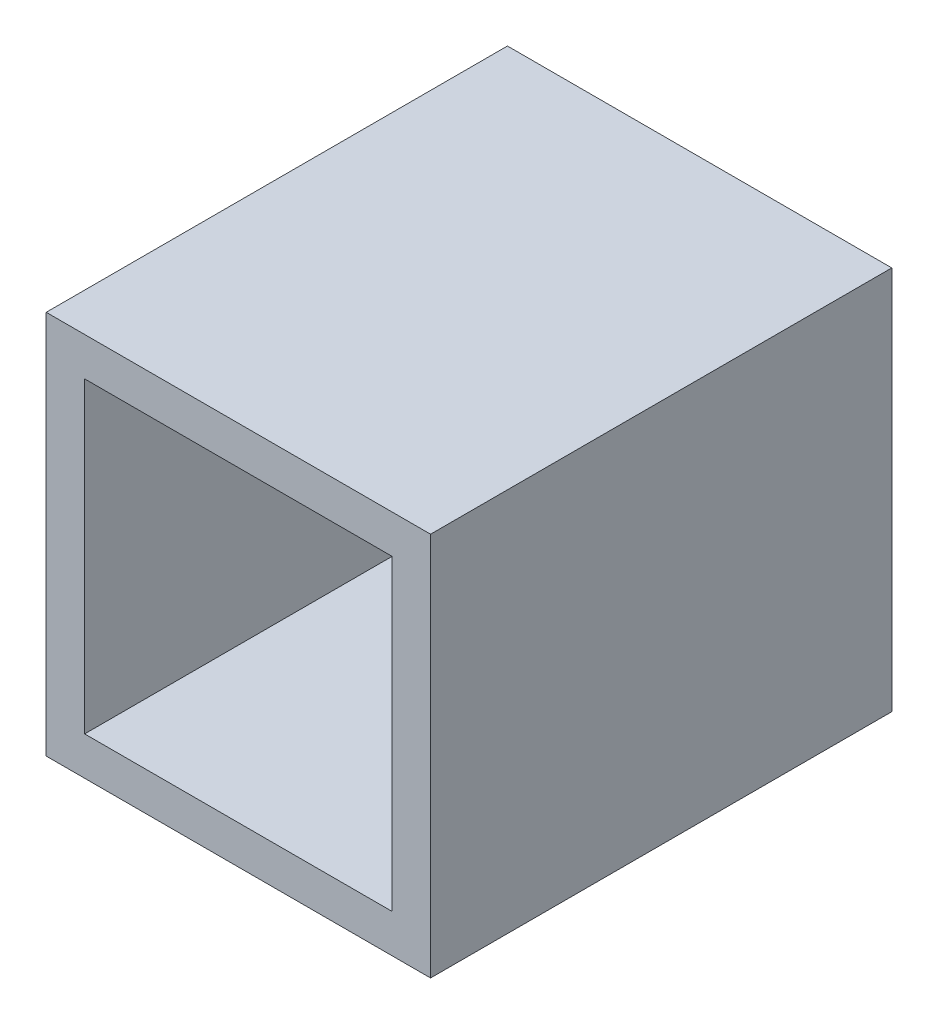
ISO-10303-21;
HEADER;
FILE_DESCRIPTION(('STEP AP214'),'2;1');
FILE_NAME('part.step','',(''),(''),'','','');
FILE_SCHEMA(('AUTOMOTIVE_DESIGN { 1 0 10303 214 1 1 1 1 }'));
ENDSEC;
DATA;
#1=APPLICATION_CONTEXT('core data for automotive mechanical design processes');
#2=APPLICATION_PROTOCOL_DEFINITION('international standard','automotive_design',2000,#1);
#3=PRODUCT_CONTEXT('',#1,'mechanical');
#4=PRODUCT('Part','Part','',(#3));
#5=PRODUCT_RELATED_PRODUCT_CATEGORY('part','',(#4));
#6=PRODUCT_DEFINITION_FORMATION('','',#4);
#7=PRODUCT_DEFINITION_CONTEXT('part definition',#1,'design');
#8=PRODUCT_DEFINITION('design','',#6,#7);
#9=PRODUCT_DEFINITION_SHAPE('','',#8);
#10=(LENGTH_UNIT() NAMED_UNIT(*) SI_UNIT(.MILLI.,.METRE.));
#11=(NAMED_UNIT(*) PLANE_ANGLE_UNIT() SI_UNIT($,.RADIAN.));
#12=(NAMED_UNIT(*) SI_UNIT($,.STERADIAN.) SOLID_ANGLE_UNIT());
#13=UNCERTAINTY_MEASURE_WITH_UNIT(LENGTH_MEASURE(1.E-05),#10,'distance_accuracy_value','');
#14=(GEOMETRIC_REPRESENTATION_CONTEXT(3) GLOBAL_UNCERTAINTY_ASSIGNED_CONTEXT((#13)) GLOBAL_UNIT_ASSIGNED_CONTEXT((#10,
#11,#12)) REPRESENTATION_CONTEXT('',''));
#15=CARTESIAN_POINT('',(0.,0.,0.));
#16=DIRECTION('',(0.,0.,1.));
#17=DIRECTION('',(1.,0.,0.));
#18=AXIS2_PLACEMENT_3D('',#15,#16,#17);
#19=CARTESIAN_POINT('',(254.01,-0.00999999999999447,0.));
#20=DIRECTION('',(0.,0.,-1.));
#21=DIRECTION('',(-1.,0.,0.));
#22=AXIS2_PLACEMENT_3D('',#19,#20,#21);
#23=PLANE('',#22);
#24=DIRECTION('',(-1.,0.,0.));
#25=VECTOR('',#24,1.);
#26=CARTESIAN_POINT('',(127.,254.,0.));
#27=LINE('',#26,#25);
#28=CARTESIAN_POINT('',(254.,254.,0.));
#29=VERTEX_POINT('',#28);
#30=CARTESIAN_POINT('',(0.,254.,0.));
#31=VERTEX_POINT('',#30);
#32=EDGE_CURVE('E80',#29,#31,#27,.T.);
#33=ORIENTED_EDGE('',*,*,#32,.F.);
#34=DIRECTION('',(0.,1.,0.));
#35=VECTOR('',#34,1.);
#36=CARTESIAN_POINT('',(254.,127.,0.));
#37=LINE('',#36,#35);
#38=CARTESIAN_POINT('',(254.,0.,0.));
#39=VERTEX_POINT('',#38);
#40=EDGE_CURVE('E82',#39,#29,#37,.T.);
#41=ORIENTED_EDGE('',*,*,#40,.F.);
#42=DIRECTION('',(1.,0.,0.));
#43=VECTOR('',#42,1.);
#44=CARTESIAN_POINT('',(127.,0.,0.));
#45=LINE('',#44,#43);
#46=CARTESIAN_POINT('',(0.,0.,0.));
#47=VERTEX_POINT('',#46);
#48=EDGE_CURVE('E21',#47,#39,#45,.T.);
#49=ORIENTED_EDGE('',*,*,#48,.F.);
#50=DIRECTION('',(0.,-1.,0.));
#51=VECTOR('',#50,1.);
#52=CARTESIAN_POINT('',(0.,127.,0.));
#53=LINE('',#52,#51);
#54=EDGE_CURVE('E104',#31,#47,#53,.T.);
#55=ORIENTED_EDGE('',*,*,#54,.F.);
#56=EDGE_LOOP('',(#33,#41,#49,#55));
#57=FACE_BOUND('',#56,.T.);
#58=ADVANCED_FACE('F17',(#57),#23,.T.);
#59=CARTESIAN_POINT('',(-0.01,0.,-0.01));
#60=DIRECTION('',(0.,-1.,0.));
#61=DIRECTION('',(1.,0.,0.));
#62=AXIS2_PLACEMENT_3D('',#59,#60,#61);
#63=PLANE('',#62);
#64=DIRECTION('',(1.,0.,0.));
#65=VECTOR('',#64,1.);
#66=CARTESIAN_POINT('',(127.,0.,304.8));
#67=LINE('',#66,#65);
#68=CARTESIAN_POINT('',(0.,0.,304.8));
#69=VERTEX_POINT('',#68);
#70=CARTESIAN_POINT('',(254.,0.,304.8));
#71=VERTEX_POINT('',#70);
#72=EDGE_CURVE('E117',#69,#71,#67,.T.);
#73=ORIENTED_EDGE('',*,*,#72,.F.);
#74=DIRECTION('',(0.,0.,1.));
#75=VECTOR('',#74,1.);
#76=CARTESIAN_POINT('',(0.,0.,152.4));
#77=LINE('',#76,#75);
#78=EDGE_CURVE('E93',#47,#69,#77,.T.);
#79=ORIENTED_EDGE('',*,*,#78,.F.);
#80=ORIENTED_EDGE('',*,*,#48,.T.);
#81=DIRECTION('',(0.,0.,-1.));
#82=VECTOR('',#81,1.);
#83=CARTESIAN_POINT('',(254.,0.,152.4));
#84=LINE('',#83,#82);
#85=EDGE_CURVE('E88',#71,#39,#84,.T.);
#86=ORIENTED_EDGE('',*,*,#85,.F.);
#87=EDGE_LOOP('',(#73,#79,#80,#86));
#88=FACE_BOUND('',#87,.T.);
#89=ADVANCED_FACE('F90',(#88),#63,.T.);
#90=CARTESIAN_POINT('',(254.,-0.01,-0.01));
#91=DIRECTION('',(1.,0.,0.));
#92=DIRECTION('',(0.,1.,0.));
#93=AXIS2_PLACEMENT_3D('',#90,#91,#92);
#94=PLANE('',#93);
#95=DIRECTION('',(0.,1.,0.));
#96=VECTOR('',#95,1.);
#97=CARTESIAN_POINT('',(254.,127.,304.8));
#98=LINE('',#97,#96);
#99=CARTESIAN_POINT('',(254.,254.,304.8));
#100=VERTEX_POINT('',#99);
#101=EDGE_CURVE('E97',#71,#100,#98,.T.);
#102=ORIENTED_EDGE('',*,*,#101,.F.);
#103=ORIENTED_EDGE('',*,*,#85,.T.);
#104=ORIENTED_EDGE('',*,*,#40,.T.);
#105=DIRECTION('',(0.,0.,-1.));
#106=VECTOR('',#105,1.);
#107=CARTESIAN_POINT('',(254.,254.,152.4));
#108=LINE('',#107,#106);
#109=EDGE_CURVE('E100',#100,#29,#108,.T.);
#110=ORIENTED_EDGE('',*,*,#109,.F.);
#111=EDGE_LOOP('',(#102,#103,#104,#110));
#112=FACE_BOUND('',#111,.T.);
#113=ADVANCED_FACE('F95',(#112),#94,.T.);
#114=CARTESIAN_POINT('',(254.01,254.,-0.01));
#115=DIRECTION('',(0.,1.,0.));
#116=DIRECTION('',(-1.,0.,0.));
#117=AXIS2_PLACEMENT_3D('',#114,#115,#116);
#118=PLANE('',#117);
#119=DIRECTION('',(-1.,0.,0.));
#120=VECTOR('',#119,1.);
#121=CARTESIAN_POINT('',(127.,254.,304.8));
#122=LINE('',#121,#120);
#123=CARTESIAN_POINT('',(0.,254.,304.8));
#124=VERTEX_POINT('',#123);
#125=EDGE_CURVE('E120',#100,#124,#122,.T.);
#126=ORIENTED_EDGE('',*,*,#125,.F.);
#127=ORIENTED_EDGE('',*,*,#109,.T.);
#128=ORIENTED_EDGE('',*,*,#32,.T.);
#129=DIRECTION('',(0.,0.,-1.));
#130=VECTOR('',#129,1.);
#131=CARTESIAN_POINT('',(0.,254.,152.4));
#132=LINE('',#131,#130);
#133=EDGE_CURVE('E107',#124,#31,#132,.T.);
#134=ORIENTED_EDGE('',*,*,#133,.F.);
#135=EDGE_LOOP('',(#126,#127,#128,#134));
#136=FACE_BOUND('',#135,.T.);
#137=ADVANCED_FACE('F210',(#136),#118,.T.);
#138=CARTESIAN_POINT('',(0.,254.01,-0.01));
#139=DIRECTION('',(-1.,0.,0.));
#140=DIRECTION('',(0.,-1.,0.));
#141=AXIS2_PLACEMENT_3D('',#138,#139,#140);
#142=PLANE('',#141);
#143=DIRECTION('',(0.,-1.,0.));
#144=VECTOR('',#143,1.);
#145=CARTESIAN_POINT('',(0.,127.,304.8));
#146=LINE('',#145,#144);
#147=EDGE_CURVE('E123',#124,#69,#146,.T.);
#148=ORIENTED_EDGE('',*,*,#147,.F.);
#149=ORIENTED_EDGE('',*,*,#133,.T.);
#150=ORIENTED_EDGE('',*,*,#54,.T.);
#151=ORIENTED_EDGE('',*,*,#78,.T.);
#152=EDGE_LOOP('',(#148,#149,#150,#151));
#153=FACE_BOUND('',#152,.T.);
#154=ADVANCED_FACE('F169',(#153),#142,.T.);
#155=CARTESIAN_POINT('',(228.6,228.61,25.39));
#156=DIRECTION('',(-1.,0.,0.));
#157=DIRECTION('',(0.,-1.,0.));
#158=AXIS2_PLACEMENT_3D('',#155,#156,#157);
#159=PLANE('',#158);
#160=DIRECTION('',(0.,-1.,0.));
#161=VECTOR('',#160,1.);
#162=CARTESIAN_POINT('',(228.6,127.,304.8));
#163=LINE('',#162,#161);
#164=CARTESIAN_POINT('',(228.6,228.6,304.8));
#165=VERTEX_POINT('',#164);
#166=CARTESIAN_POINT('',(228.6,25.4,304.8));
#167=VERTEX_POINT('',#166);
#168=EDGE_CURVE('E129',#165,#167,#163,.T.);
#169=ORIENTED_EDGE('',*,*,#168,.F.);
#170=DIRECTION('',(0.,0.,1.));
#171=VECTOR('',#170,1.);
#172=CARTESIAN_POINT('',(228.6,228.6,165.1));
#173=LINE('',#172,#171);
#174=CARTESIAN_POINT('',(228.6,228.6,25.4));
#175=VERTEX_POINT('',#174);
#176=EDGE_CURVE('E115',#175,#165,#173,.T.);
#177=ORIENTED_EDGE('',*,*,#176,.F.);
#178=DIRECTION('',(0.,1.,0.));
#179=VECTOR('',#178,1.);
#180=CARTESIAN_POINT('',(228.6,127.,25.4));
#181=LINE('',#180,#179);
#182=CARTESIAN_POINT('',(228.6,25.4,25.4));
#183=VERTEX_POINT('',#182);
#184=EDGE_CURVE('E110',#183,#175,#181,.T.);
#185=ORIENTED_EDGE('',*,*,#184,.F.);
#186=DIRECTION('',(0.,0.,-1.));
#187=VECTOR('',#186,1.);
#188=CARTESIAN_POINT('',(228.6,25.4,165.1));
#189=LINE('',#188,#187);
#190=EDGE_CURVE('E135',#167,#183,#189,.T.);
#191=ORIENTED_EDGE('',*,*,#190,.F.);
#192=EDGE_LOOP('',(#169,#177,#185,#191));
#193=FACE_BOUND('',#192,.T.);
#194=ADVANCED_FACE('F155',(#193),#159,.T.);
#195=CARTESIAN_POINT('',(25.3899999999999,25.39,25.4));
#196=DIRECTION('',(0.,0.,1.));
#197=DIRECTION('',(1.,0.,0.));
#198=AXIS2_PLACEMENT_3D('',#195,#196,#197);
#199=PLANE('',#198);
#200=DIRECTION('',(1.,0.,0.));
#201=VECTOR('',#200,1.);
#202=CARTESIAN_POINT('',(127.,228.6,25.4));
#203=LINE('',#202,#201);
#204=CARTESIAN_POINT('',(25.3999999999999,228.6,25.4));
#205=VERTEX_POINT('',#204);
#206=EDGE_CURVE('E112',#205,#175,#203,.T.);
#207=ORIENTED_EDGE('',*,*,#206,.F.);
#208=DIRECTION('',(0.,1.,0.));
#209=VECTOR('',#208,1.);
#210=CARTESIAN_POINT('',(25.4,127.,25.4));
#211=LINE('',#210,#209);
#212=CARTESIAN_POINT('',(25.4,25.4,25.4));
#213=VERTEX_POINT('',#212);
#214=EDGE_CURVE('E138',#213,#205,#211,.T.);
#215=ORIENTED_EDGE('',*,*,#214,.F.);
#216=DIRECTION('',(-1.,0.,0.));
#217=VECTOR('',#216,1.);
#218=CARTESIAN_POINT('',(127.,25.4,25.4));
#219=LINE('',#218,#217);
#220=EDGE_CURVE('E131',#183,#213,#219,.T.);
#221=ORIENTED_EDGE('',*,*,#220,.F.);
#222=ORIENTED_EDGE('',*,*,#184,.T.);
#223=EDGE_LOOP('',(#207,#215,#221,#222));
#224=FACE_BOUND('',#223,.T.);
#225=ADVANCED_FACE('F160',(#224),#199,.T.);
#226=CARTESIAN_POINT('',(25.3899999999999,228.6,25.39));
#227=DIRECTION('',(0.,-1.,0.));
#228=DIRECTION('',(1.,0.,0.));
#229=AXIS2_PLACEMENT_3D('',#226,#227,#228);
#230=PLANE('',#229);
#231=DIRECTION('',(1.,0.,0.));
#232=VECTOR('',#231,1.);
#233=CARTESIAN_POINT('',(127.,228.6,304.8));
#234=LINE('',#233,#232);
#235=CARTESIAN_POINT('',(25.3999999999999,228.6,304.8));
#236=VERTEX_POINT('',#235);
#237=EDGE_CURVE('E126',#236,#165,#234,.T.);
#238=ORIENTED_EDGE('',*,*,#237,.F.);
#239=DIRECTION('',(0.,0.,1.));
#240=VECTOR('',#239,1.);
#241=CARTESIAN_POINT('',(25.3999999999999,228.6,165.1));
#242=LINE('',#241,#240);
#243=EDGE_CURVE('E141',#205,#236,#242,.T.);
#244=ORIENTED_EDGE('',*,*,#243,.F.);
#245=ORIENTED_EDGE('',*,*,#206,.T.);
#246=ORIENTED_EDGE('',*,*,#176,.T.);
#247=EDGE_LOOP('',(#238,#244,#245,#246));
#248=FACE_BOUND('',#247,.T.);
#249=ADVANCED_FACE('F152',(#248),#230,.T.);
#250=CARTESIAN_POINT('',(-0.0100000000000655,-0.00999999999999447,304.8));
#251=DIRECTION('',(0.,0.,1.));
#252=DIRECTION('',(1.,0.,0.));
#253=AXIS2_PLACEMENT_3D('',#250,#251,#252);
#254=PLANE('',#253);
#255=ORIENTED_EDGE('',*,*,#168,.T.);
#256=DIRECTION('',(1.,0.,0.));
#257=VECTOR('',#256,1.);
#258=CARTESIAN_POINT('',(127.,25.4,304.8));
#259=LINE('',#258,#257);
#260=CARTESIAN_POINT('',(25.4,25.4,304.8));
#261=VERTEX_POINT('',#260);
#262=EDGE_CURVE('E36',#261,#167,#259,.T.);
#263=ORIENTED_EDGE('',*,*,#262,.F.);
#264=DIRECTION('',(0.,-1.,0.));
#265=VECTOR('',#264,1.);
#266=CARTESIAN_POINT('',(25.4,127.,304.8));
#267=LINE('',#266,#265);
#268=EDGE_CURVE('E27',#236,#261,#267,.T.);
#269=ORIENTED_EDGE('',*,*,#268,.F.);
#270=ORIENTED_EDGE('',*,*,#237,.T.);
#271=EDGE_LOOP('',(#255,#263,#269,#270));
#272=FACE_BOUND('',#271,.T.);
#273=ORIENTED_EDGE('',*,*,#125,.T.);
#274=ORIENTED_EDGE('',*,*,#147,.T.);
#275=ORIENTED_EDGE('',*,*,#72,.T.);
#276=ORIENTED_EDGE('',*,*,#101,.T.);
#277=EDGE_LOOP('',(#273,#274,#275,#276));
#278=FACE_BOUND('',#277,.T.);
#279=ADVANCED_FACE('F147',(#272,#278),#254,.T.);
#280=CARTESIAN_POINT('',(228.61,25.4,25.39));
#281=DIRECTION('',(0.,1.,0.));
#282=DIRECTION('',(-1.,0.,0.));
#283=AXIS2_PLACEMENT_3D('',#280,#281,#282);
#284=PLANE('',#283);
#285=ORIENTED_EDGE('',*,*,#262,.T.);
#286=ORIENTED_EDGE('',*,*,#190,.T.);
#287=ORIENTED_EDGE('',*,*,#220,.T.);
#288=DIRECTION('',(0.,0.,-1.));
#289=VECTOR('',#288,1.);
#290=CARTESIAN_POINT('',(25.4,25.4,165.1));
#291=LINE('',#290,#289);
#292=EDGE_CURVE('E11',#261,#213,#291,.T.);
#293=ORIENTED_EDGE('',*,*,#292,.F.);
#294=EDGE_LOOP('',(#285,#286,#287,#293));
#295=FACE_BOUND('',#294,.T.);
#296=ADVANCED_FACE('F158',(#295),#284,.T.);
#297=CARTESIAN_POINT('',(25.4,25.39,25.39));
#298=DIRECTION('',(1.,0.,0.));
#299=DIRECTION('',(0.,1.,0.));
#300=AXIS2_PLACEMENT_3D('',#297,#298,#299);
#301=PLANE('',#300);
#302=ORIENTED_EDGE('',*,*,#268,.T.);
#303=ORIENTED_EDGE('',*,*,#292,.T.);
#304=ORIENTED_EDGE('',*,*,#214,.T.);
#305=ORIENTED_EDGE('',*,*,#243,.T.);
#306=EDGE_LOOP('',(#302,#303,#304,#305));
#307=FACE_BOUND('',#306,.T.);
#308=ADVANCED_FACE('F19',(#307),#301,.T.);
#309=CLOSED_SHELL('',(#58,#89,#113,#137,#154,#194,#225,#249,#279,#296,#308));
#310=MANIFOLD_SOLID_BREP('B1',#309);
#311=ADVANCED_BREP_SHAPE_REPRESENTATION('',(#18,#310),#14);
#312=SHAPE_DEFINITION_REPRESENTATION(#9,#311);
ENDSEC;
END-ISO-10303-21;
